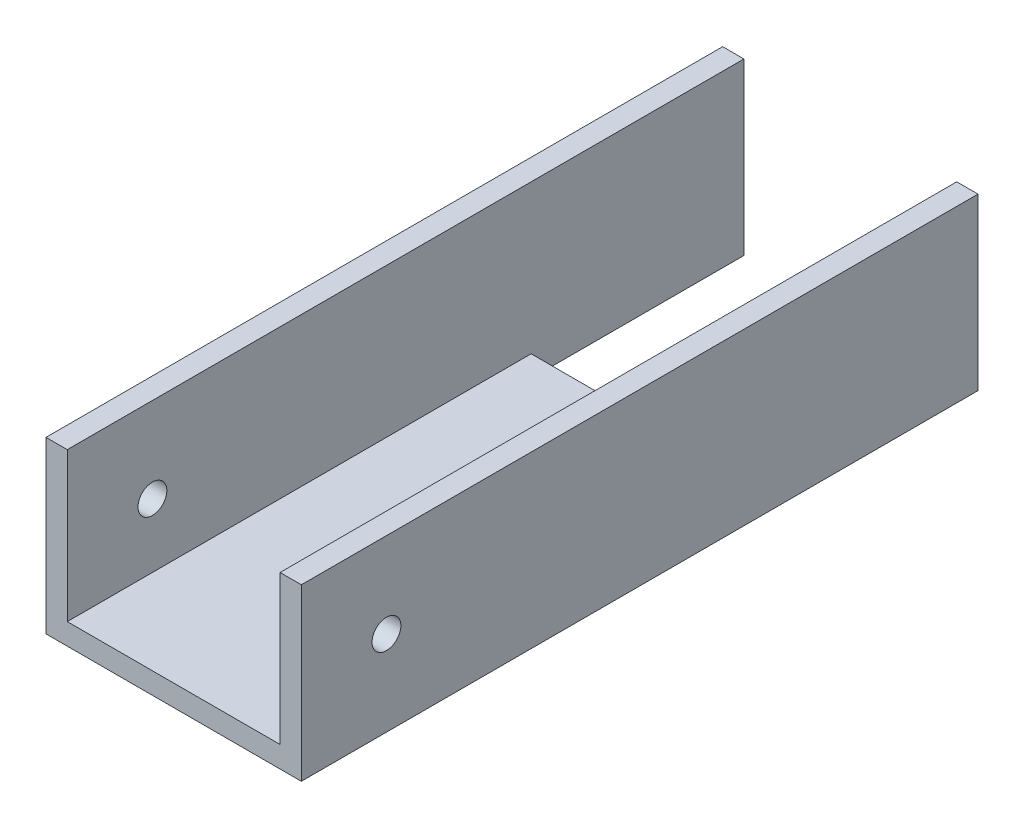
ISO-10303-21;
HEADER;
FILE_DESCRIPTION(('STEP AP214'),'2;1');
FILE_NAME('part.step','',(''),(''),'','','');
FILE_SCHEMA(('AUTOMOTIVE_DESIGN { 1 0 10303 214 1 1 1 1 }'));
ENDSEC;
DATA;
#1=APPLICATION_CONTEXT('core data for automotive mechanical design processes');
#2=APPLICATION_PROTOCOL_DEFINITION('international standard','automotive_design',2000,#1);
#3=PRODUCT_CONTEXT('',#1,'mechanical');
#4=PRODUCT('Part','Part','',(#3));
#5=PRODUCT_RELATED_PRODUCT_CATEGORY('part','',(#4));
#6=PRODUCT_DEFINITION_FORMATION('','',#4);
#7=PRODUCT_DEFINITION_CONTEXT('part definition',#1,'design');
#8=PRODUCT_DEFINITION('design','',#6,#7);
#9=PRODUCT_DEFINITION_SHAPE('','',#8);
#10=(LENGTH_UNIT() NAMED_UNIT(*) SI_UNIT(.MILLI.,.METRE.));
#11=(NAMED_UNIT(*) PLANE_ANGLE_UNIT() SI_UNIT($,.RADIAN.));
#12=(NAMED_UNIT(*) SI_UNIT($,.STERADIAN.) SOLID_ANGLE_UNIT());
#13=UNCERTAINTY_MEASURE_WITH_UNIT(LENGTH_MEASURE(1.E-05),#10,'distance_accuracy_value','');
#14=(GEOMETRIC_REPRESENTATION_CONTEXT(3) GLOBAL_UNCERTAINTY_ASSIGNED_CONTEXT((#13)) GLOBAL_UNIT_ASSIGNED_CONTEXT((#10,
#11,#12)) REPRESENTATION_CONTEXT('',''));
#15=CARTESIAN_POINT('',(0.,0.,0.));
#16=DIRECTION('',(0.,0.,1.));
#17=DIRECTION('',(1.,0.,0.));
#18=AXIS2_PLACEMENT_3D('',#15,#16,#17);
#19=CARTESIAN_POINT('',(0.,0.,-609.6));
#20=DIRECTION('',(0.,0.,1.));
#21=DIRECTION('',(1.,0.,0.));
#22=AXIS2_PLACEMENT_3D('',#19,#20,#21);
#23=PLANE('',#22);
#24=DIRECTION('',(1.,0.,0.));
#25=VECTOR('',#24,1.);
#26=CARTESIAN_POINT('',(-19.05,-12.7,-609.6));
#27=LINE('',#26,#25);
#28=CARTESIAN_POINT('',(15.875,-12.7,-609.6));
#29=VERTEX_POINT('',#28);
#30=CARTESIAN_POINT('',(19.05,-12.7,-609.6));
#31=VERTEX_POINT('',#30);
#32=EDGE_CURVE('E186',#29,#31,#27,.T.);
#33=ORIENTED_EDGE('',*,*,#32,.F.);
#34=DIRECTION('',(0.,-1.,0.));
#35=VECTOR('',#34,1.);
#36=CARTESIAN_POINT('',(15.875,12.7,-609.6));
#37=LINE('',#36,#35);
#38=CARTESIAN_POINT('',(15.875,12.7,-609.6));
#39=VERTEX_POINT('',#38);
#40=EDGE_CURVE('E203',#39,#29,#37,.T.);
#41=ORIENTED_EDGE('',*,*,#40,.F.);
#42=DIRECTION('',(-1.,0.,0.));
#43=VECTOR('',#42,1.);
#44=CARTESIAN_POINT('',(19.05,12.7,-609.6));
#45=LINE('',#44,#43);
#46=CARTESIAN_POINT('',(19.05,12.7,-609.6));
#47=VERTEX_POINT('',#46);
#48=EDGE_CURVE('E196',#47,#39,#45,.T.);
#49=ORIENTED_EDGE('',*,*,#48,.F.);
#50=DIRECTION('',(0.,1.,0.));
#51=VECTOR('',#50,1.);
#52=CARTESIAN_POINT('',(19.05,-12.7,-609.6));
#53=LINE('',#52,#51);
#54=EDGE_CURVE('E191',#31,#47,#53,.T.);
#55=ORIENTED_EDGE('',*,*,#54,.F.);
#56=EDGE_LOOP('',(#33,#41,#49,#55));
#57=FACE_BOUND('',#56,.T.);
#58=ADVANCED_FACE('F44',(#57),#23,.F.);
#59=CARTESIAN_POINT('',(-15.875,12.7,609.6));
#60=DIRECTION('',(0.,-1.,0.));
#61=DIRECTION('',(0.,0.,-1.));
#62=AXIS2_PLACEMENT_3D('',#59,#60,#61);
#63=PLANE('',#62);
#64=DIRECTION('',(0.,0.,-1.));
#65=VECTOR('',#64,1.);
#66=CARTESIAN_POINT('',(-19.05,12.7,609.6));
#67=LINE('',#66,#65);
#68=CARTESIAN_POINT('',(-19.05,12.7,-508.635));
#69=VERTEX_POINT('',#68);
#70=CARTESIAN_POINT('',(-19.05,12.7,-609.6));
#71=VERTEX_POINT('',#70);
#72=EDGE_CURVE('E11',#69,#71,#67,.T.);
#73=ORIENTED_EDGE('',*,*,#72,.F.);
#74=DIRECTION('',(-1.,0.,0.));
#75=VECTOR('',#74,1.);
#76=CARTESIAN_POINT('',(-19.05,12.7,-508.635));
#77=LINE('',#76,#75);
#78=CARTESIAN_POINT('',(-15.875,12.7,-508.635));
#79=VERTEX_POINT('',#78);
#80=EDGE_CURVE('E211',#79,#69,#77,.T.);
#81=ORIENTED_EDGE('',*,*,#80,.F.);
#82=DIRECTION('',(0.,0.,-1.));
#83=VECTOR('',#82,1.);
#84=CARTESIAN_POINT('',(-15.875,12.7,609.6));
#85=LINE('',#84,#83);
#86=CARTESIAN_POINT('',(-15.875,12.7,-609.6));
#87=VERTEX_POINT('',#86);
#88=EDGE_CURVE('E157',#79,#87,#85,.T.);
#89=ORIENTED_EDGE('',*,*,#88,.T.);
#90=DIRECTION('',(-1.,0.,0.));
#91=VECTOR('',#90,1.);
#92=CARTESIAN_POINT('',(-15.875,12.7,-609.6));
#93=LINE('',#92,#91);
#94=EDGE_CURVE('E187',#87,#71,#93,.T.);
#95=ORIENTED_EDGE('',*,*,#94,.T.);
#96=EDGE_LOOP('',(#73,#81,#89,#95));
#97=FACE_BOUND('',#96,.T.);
#98=ADVANCED_FACE('F46',(#97),#63,.F.);
#99=CARTESIAN_POINT('',(-19.05,12.7,609.6));
#100=DIRECTION('',(1.,0.,0.));
#101=DIRECTION('',(0.,1.,0.));
#102=AXIS2_PLACEMENT_3D('',#99,#100,#101);
#103=PLANE('',#102);
#104=CARTESIAN_POINT('',(-19.05,0.,-521.335));
#105=DIRECTION('',(1.,0.,0.));
#106=DIRECTION('',(0.,0.,-1.));
#107=AXIS2_PLACEMENT_3D('',#104,#105,#106);
#108=CIRCLE('',#107,2.15264999999998);
#109=CARTESIAN_POINT('',(-19.05,0.,-523.48765));
#110=VERTEX_POINT('',#109);
#111=EDGE_CURVE('E249',#110,#110,#108,.T.);
#112=ORIENTED_EDGE('',*,*,#111,.T.);
#113=EDGE_LOOP('',(#112));
#114=FACE_BOUND('',#113,.T.);
#115=DIRECTION('',(0.,0.,-1.));
#116=VECTOR('',#115,1.);
#117=CARTESIAN_POINT('',(-19.05,-12.7,609.6));
#118=LINE('',#117,#116);
#119=CARTESIAN_POINT('',(-19.05,-12.7,-508.635));
#120=VERTEX_POINT('',#119);
#121=CARTESIAN_POINT('',(-19.05,-12.7,-609.6));
#122=VERTEX_POINT('',#121);
#123=EDGE_CURVE('E54',#120,#122,#118,.T.);
#124=ORIENTED_EDGE('',*,*,#123,.F.);
#125=DIRECTION('',(0.,-1.,0.));
#126=VECTOR('',#125,1.);
#127=CARTESIAN_POINT('',(-19.05,-12.7,-508.635));
#128=LINE('',#127,#126);
#129=EDGE_CURVE('E146',#69,#120,#128,.T.);
#130=ORIENTED_EDGE('',*,*,#129,.F.);
#131=ORIENTED_EDGE('',*,*,#72,.T.);
#132=DIRECTION('',(0.,-1.,0.));
#133=VECTOR('',#132,1.);
#134=CARTESIAN_POINT('',(-19.05,12.7,-609.6));
#135=LINE('',#134,#133);
#136=EDGE_CURVE('E181',#71,#122,#135,.T.);
#137=ORIENTED_EDGE('',*,*,#136,.T.);
#138=EDGE_LOOP('',(#124,#130,#131,#137));
#139=FACE_BOUND('',#138,.T.);
#140=ADVANCED_FACE('F182',(#114,#139),#103,.F.);
#141=CARTESIAN_POINT('',(-19.05,-12.7,609.6));
#142=DIRECTION('',(0.,1.,0.));
#143=DIRECTION('',(0.,0.,1.));
#144=AXIS2_PLACEMENT_3D('',#141,#142,#143);
#145=PLANE('',#144);
#146=DIRECTION('',(-1.,0.,0.));
#147=VECTOR('',#146,1.);
#148=CARTESIAN_POINT('',(15.875,-12.7,-577.85));
#149=LINE('',#148,#147);
#150=CARTESIAN_POINT('',(15.875,-12.7,-577.85));
#151=VERTEX_POINT('',#150);
#152=CARTESIAN_POINT('',(-15.875,-12.7,-577.85));
#153=VERTEX_POINT('',#152);
#154=EDGE_CURVE('E240',#151,#153,#149,.T.);
#155=ORIENTED_EDGE('',*,*,#154,.F.);
#156=DIRECTION('',(0.,0.,1.));
#157=VECTOR('',#156,1.);
#158=CARTESIAN_POINT('',(15.875,-12.7,-609.6));
#159=LINE('',#158,#157);
#160=EDGE_CURVE('E131',#29,#151,#159,.T.);
#161=ORIENTED_EDGE('',*,*,#160,.F.);
#162=ORIENTED_EDGE('',*,*,#32,.T.);
#163=DIRECTION('',(0.,0.,-1.));
#164=VECTOR('',#163,1.);
#165=CARTESIAN_POINT('',(19.05,-12.7,609.6));
#166=LINE('',#165,#164);
#167=CARTESIAN_POINT('',(19.05,-12.7,-508.635));
#168=VERTEX_POINT('',#167);
#169=EDGE_CURVE('E163',#168,#31,#166,.T.);
#170=ORIENTED_EDGE('',*,*,#169,.F.);
#171=DIRECTION('',(1.,0.,0.));
#172=VECTOR('',#171,1.);
#173=CARTESIAN_POINT('',(19.05,-12.7,-508.635));
#174=LINE('',#173,#172);
#175=EDGE_CURVE('E177',#120,#168,#174,.T.);
#176=ORIENTED_EDGE('',*,*,#175,.F.);
#177=ORIENTED_EDGE('',*,*,#123,.T.);
#178=CARTESIAN_POINT('',(-15.875,-12.7,-609.6));
#179=VERTEX_POINT('',#178);
#180=EDGE_CURVE('E175',#122,#179,#27,.T.);
#181=ORIENTED_EDGE('',*,*,#180,.T.);
#182=DIRECTION('',(0.,0.,-1.));
#183=VECTOR('',#182,1.);
#184=CARTESIAN_POINT('',(-15.875,-12.7,-609.6));
#185=LINE('',#184,#183);
#186=EDGE_CURVE('E137',#153,#179,#185,.T.);
#187=ORIENTED_EDGE('',*,*,#186,.F.);
#188=EDGE_LOOP('',(#155,#161,#162,#170,#176,#177,#181,#187));
#189=FACE_BOUND('',#188,.T.);
#190=ADVANCED_FACE('F173',(#189),#145,.F.);
#191=CARTESIAN_POINT('',(19.05,-12.7,609.6));
#192=DIRECTION('',(-1.,0.,0.));
#193=DIRECTION('',(0.,-1.,0.));
#194=AXIS2_PLACEMENT_3D('',#191,#192,#193);
#195=PLANE('',#194);
#196=CARTESIAN_POINT('',(19.05,0.,-521.335));
#197=DIRECTION('',(1.,0.,0.));
#198=DIRECTION('',(0.,0.,-1.));
#199=AXIS2_PLACEMENT_3D('',#196,#197,#198);
#200=CIRCLE('',#199,2.15264999999999);
#201=CARTESIAN_POINT('',(19.05,0.,-523.48765));
#202=VERTEX_POINT('',#201);
#203=EDGE_CURVE('E253',#202,#202,#200,.T.);
#204=ORIENTED_EDGE('',*,*,#203,.F.);
#205=EDGE_LOOP('',(#204));
#206=FACE_BOUND('',#205,.T.);
#207=DIRECTION('',(0.,0.,-1.));
#208=VECTOR('',#207,1.);
#209=CARTESIAN_POINT('',(19.05,12.7,609.6));
#210=LINE('',#209,#208);
#211=CARTESIAN_POINT('',(19.05,12.7,-508.635));
#212=VERTEX_POINT('',#211);
#213=EDGE_CURVE('E155',#212,#47,#210,.T.);
#214=ORIENTED_EDGE('',*,*,#213,.F.);
#215=DIRECTION('',(0.,1.,0.));
#216=VECTOR('',#215,1.);
#217=CARTESIAN_POINT('',(19.05,12.7,-508.635));
#218=LINE('',#217,#216);
#219=EDGE_CURVE('E229',#168,#212,#218,.T.);
#220=ORIENTED_EDGE('',*,*,#219,.F.);
#221=ORIENTED_EDGE('',*,*,#169,.T.);
#222=ORIENTED_EDGE('',*,*,#54,.T.);
#223=EDGE_LOOP('',(#214,#220,#221,#222));
#224=FACE_BOUND('',#223,.T.);
#225=ADVANCED_FACE('F261',(#206,#224),#195,.F.);
#226=CARTESIAN_POINT('',(19.05,12.7,609.6));
#227=DIRECTION('',(0.,-1.,0.));
#228=DIRECTION('',(0.,0.,-1.));
#229=AXIS2_PLACEMENT_3D('',#226,#227,#228);
#230=PLANE('',#229);
#231=DIRECTION('',(0.,0.,-1.));
#232=VECTOR('',#231,1.);
#233=CARTESIAN_POINT('',(15.875,12.7,609.6));
#234=LINE('',#233,#232);
#235=CARTESIAN_POINT('',(15.875,12.7,-508.635));
#236=VERTEX_POINT('',#235);
#237=EDGE_CURVE('E150',#236,#39,#234,.T.);
#238=ORIENTED_EDGE('',*,*,#237,.F.);
#239=DIRECTION('',(-1.,0.,0.));
#240=VECTOR('',#239,1.);
#241=CARTESIAN_POINT('',(15.875,12.7,-508.635));
#242=LINE('',#241,#240);
#243=EDGE_CURVE('E226',#212,#236,#242,.T.);
#244=ORIENTED_EDGE('',*,*,#243,.F.);
#245=ORIENTED_EDGE('',*,*,#213,.T.);
#246=ORIENTED_EDGE('',*,*,#48,.T.);
#247=EDGE_LOOP('',(#238,#244,#245,#246));
#248=FACE_BOUND('',#247,.T.);
#249=ADVANCED_FACE('F264',(#248),#230,.F.);
#250=CARTESIAN_POINT('',(15.875,12.7,609.6));
#251=DIRECTION('',(1.,0.,0.));
#252=DIRECTION('',(0.,1.,0.));
#253=AXIS2_PLACEMENT_3D('',#250,#251,#252);
#254=PLANE('',#253);
#255=CARTESIAN_POINT('',(15.875,0.,-521.335));
#256=DIRECTION('',(1.,0.,0.));
#257=DIRECTION('',(0.,1.,0.));
#258=AXIS2_PLACEMENT_3D('',#255,#256,#257);
#259=CIRCLE('',#258,2.15264999999998);
#260=CARTESIAN_POINT('',(15.875,2.15264999999999,-521.335));
#261=VERTEX_POINT('',#260);
#262=EDGE_CURVE('E245',#261,#261,#259,.T.);
#263=ORIENTED_EDGE('',*,*,#262,.T.);
#264=EDGE_LOOP('',(#263));
#265=FACE_BOUND('',#264,.T.);
#266=DIRECTION('',(0.,0.,-1.));
#267=VECTOR('',#266,1.);
#268=CARTESIAN_POINT('',(15.875,-9.525,609.6));
#269=LINE('',#268,#267);
#270=CARTESIAN_POINT('',(15.875,-9.525,-508.635));
#271=VERTEX_POINT('',#270);
#272=CARTESIAN_POINT('',(15.875,-9.525,-577.85));
#273=VERTEX_POINT('',#272);
#274=EDGE_CURVE('E129',#271,#273,#269,.T.);
#275=ORIENTED_EDGE('',*,*,#274,.F.);
#276=DIRECTION('',(0.,-1.,0.));
#277=VECTOR('',#276,1.);
#278=CARTESIAN_POINT('',(15.875,-9.525,-508.635));
#279=LINE('',#278,#277);
#280=EDGE_CURVE('E223',#236,#271,#279,.T.);
#281=ORIENTED_EDGE('',*,*,#280,.F.);
#282=ORIENTED_EDGE('',*,*,#237,.T.);
#283=ORIENTED_EDGE('',*,*,#40,.T.);
#284=ORIENTED_EDGE('',*,*,#160,.T.);
#285=DIRECTION('',(0.,-1.,0.));
#286=VECTOR('',#285,1.);
#287=CARTESIAN_POINT('',(15.875,12.701,-577.85));
#288=LINE('',#287,#286);
#289=EDGE_CURVE('E124',#273,#151,#288,.T.);
#290=ORIENTED_EDGE('',*,*,#289,.F.);
#291=EDGE_LOOP('',(#275,#281,#282,#283,#284,#290));
#292=FACE_BOUND('',#291,.T.);
#293=ADVANCED_FACE('F126',(#265,#292),#254,.F.);
#294=CARTESIAN_POINT('',(15.875,-9.525,609.6));
#295=DIRECTION('',(0.,-1.,0.));
#296=DIRECTION('',(1.,0.,0.));
#297=AXIS2_PLACEMENT_3D('',#294,#295,#296);
#298=PLANE('',#297);
#299=ORIENTED_EDGE('',*,*,#274,.T.);
#300=DIRECTION('',(1.,0.,0.));
#301=VECTOR('',#300,1.);
#302=CARTESIAN_POINT('',(15.875,-9.525,-577.85));
#303=LINE('',#302,#301);
#304=CARTESIAN_POINT('',(-15.875,-9.52500000000001,-577.85));
#305=VERTEX_POINT('',#304);
#306=EDGE_CURVE('E140',#305,#273,#303,.T.);
#307=ORIENTED_EDGE('',*,*,#306,.F.);
#308=DIRECTION('',(0.,0.,-1.));
#309=VECTOR('',#308,1.);
#310=CARTESIAN_POINT('',(-15.875,-9.52500000000001,609.6));
#311=LINE('',#310,#309);
#312=CARTESIAN_POINT('',(-15.875,-9.52500000000001,-508.634999999999));
#313=VERTEX_POINT('',#312);
#314=EDGE_CURVE('E151',#313,#305,#311,.T.);
#315=ORIENTED_EDGE('',*,*,#314,.F.);
#316=DIRECTION('',(-1.,0.,0.));
#317=VECTOR('',#316,1.);
#318=CARTESIAN_POINT('',(-15.875,-9.52500000000001,-508.635));
#319=LINE('',#318,#317);
#320=EDGE_CURVE('E69',#271,#313,#319,.T.);
#321=ORIENTED_EDGE('',*,*,#320,.F.);
#322=EDGE_LOOP('',(#299,#307,#315,#321));
#323=FACE_BOUND('',#322,.T.);
#324=ADVANCED_FACE('F148',(#323),#298,.F.);
#325=CARTESIAN_POINT('',(-15.875,-9.52500000000001,609.6));
#326=DIRECTION('',(-1.,0.,0.));
#327=DIRECTION('',(0.,0.,1.));
#328=AXIS2_PLACEMENT_3D('',#325,#326,#327);
#329=PLANE('',#328);
#330=CARTESIAN_POINT('',(-15.875,0.,-521.335));
#331=DIRECTION('',(-1.,0.,0.));
#332=DIRECTION('',(0.,0.,1.));
#333=AXIS2_PLACEMENT_3D('',#330,#331,#332);
#334=CIRCLE('',#333,2.15264999999998);
#335=CARTESIAN_POINT('',(-15.875,0.,-519.18235));
#336=VERTEX_POINT('',#335);
#337=EDGE_CURVE('E48',#336,#336,#334,.T.);
#338=ORIENTED_EDGE('',*,*,#337,.T.);
#339=EDGE_LOOP('',(#338));
#340=FACE_BOUND('',#339,.T.);
#341=ORIENTED_EDGE('',*,*,#88,.F.);
#342=DIRECTION('',(0.,1.,0.));
#343=VECTOR('',#342,1.);
#344=CARTESIAN_POINT('',(-15.875,12.7,-508.635));
#345=LINE('',#344,#343);
#346=EDGE_CURVE('E216',#313,#79,#345,.T.);
#347=ORIENTED_EDGE('',*,*,#346,.F.);
#348=ORIENTED_EDGE('',*,*,#314,.T.);
#349=DIRECTION('',(0.,-1.,0.));
#350=VECTOR('',#349,1.);
#351=CARTESIAN_POINT('',(-15.875,12.701,-577.85));
#352=LINE('',#351,#350);
#353=EDGE_CURVE('E136',#305,#153,#352,.T.);
#354=ORIENTED_EDGE('',*,*,#353,.T.);
#355=ORIENTED_EDGE('',*,*,#186,.T.);
#356=DIRECTION('',(0.,1.,0.));
#357=VECTOR('',#356,1.);
#358=CARTESIAN_POINT('',(-15.875,-9.52500000000001,-609.6));
#359=LINE('',#358,#357);
#360=EDGE_CURVE('E61',#179,#87,#359,.T.);
#361=ORIENTED_EDGE('',*,*,#360,.T.);
#362=EDGE_LOOP('',(#341,#347,#348,#354,#355,#361));
#363=FACE_BOUND('',#362,.T.);
#364=ADVANCED_FACE('F213',(#340,#363),#329,.F.);
#365=ORIENTED_EDGE('',*,*,#360,.F.);
#366=ORIENTED_EDGE('',*,*,#180,.F.);
#367=ORIENTED_EDGE('',*,*,#136,.F.);
#368=ORIENTED_EDGE('',*,*,#94,.F.);
#369=EDGE_LOOP('',(#365,#366,#367,#368));
#370=FACE_BOUND('',#369,.T.);
#371=ADVANCED_FACE('F189',(#370),#23,.F.);
#372=CARTESIAN_POINT('',(0.,0.,-508.635));
#373=DIRECTION('',(0.,0.,-1.));
#374=DIRECTION('',(-1.,0.,0.));
#375=AXIS2_PLACEMENT_3D('',#372,#373,#374);
#376=PLANE('',#375);
#377=ORIENTED_EDGE('',*,*,#129,.T.);
#378=ORIENTED_EDGE('',*,*,#175,.T.);
#379=ORIENTED_EDGE('',*,*,#219,.T.);
#380=ORIENTED_EDGE('',*,*,#243,.T.);
#381=ORIENTED_EDGE('',*,*,#280,.T.);
#382=ORIENTED_EDGE('',*,*,#320,.T.);
#383=ORIENTED_EDGE('',*,*,#346,.T.);
#384=ORIENTED_EDGE('',*,*,#80,.T.);
#385=EDGE_LOOP('',(#377,#378,#379,#380,#381,#382,#383,#384));
#386=FACE_BOUND('',#385,.T.);
#387=ADVANCED_FACE('F274',(#386),#376,.F.);
#388=CARTESIAN_POINT('',(15.875,12.701,-577.85));
#389=DIRECTION('',(0.,0.,1.));
#390=DIRECTION('',(1.,0.,0.));
#391=AXIS2_PLACEMENT_3D('',#388,#389,#390);
#392=PLANE('',#391);
#393=ORIENTED_EDGE('',*,*,#306,.T.);
#394=ORIENTED_EDGE('',*,*,#289,.T.);
#395=ORIENTED_EDGE('',*,*,#154,.T.);
#396=ORIENTED_EDGE('',*,*,#353,.F.);
#397=EDGE_LOOP('',(#393,#394,#395,#396));
#398=FACE_BOUND('',#397,.T.);
#399=ADVANCED_FACE('F141',(#398),#392,.F.);
#400=CARTESIAN_POINT('',(19.05,0.,-521.335));
#401=DIRECTION('',(1.,0.,0.));
#402=DIRECTION('',(0.,0.,-1.));
#403=AXIS2_PLACEMENT_3D('',#400,#401,#402);
#404=CYLINDRICAL_SURFACE('',#403,2.15264999999998);
#405=ORIENTED_EDGE('',*,*,#111,.F.);
#406=EDGE_LOOP('',(#405));
#407=FACE_BOUND('',#406,.T.);
#408=ORIENTED_EDGE('',*,*,#337,.F.);
#409=EDGE_LOOP('',(#408));
#410=FACE_BOUND('',#409,.T.);
#411=ADVANCED_FACE('F311',(#407,#410),#404,.F.);
#412=ORIENTED_EDGE('',*,*,#203,.T.);
#413=EDGE_LOOP('',(#412));
#414=FACE_BOUND('',#413,.T.);
#415=ORIENTED_EDGE('',*,*,#262,.F.);
#416=EDGE_LOOP('',(#415));
#417=FACE_BOUND('',#416,.T.);
#418=ADVANCED_FACE('F258',(#414,#417),#404,.F.);
#419=CLOSED_SHELL('',(#58,#98,#140,#190,#225,#249,#293,#324,#364,#371,#387,#399,#411,#418));
#420=MANIFOLD_SOLID_BREP('B2',#419);
#421=ADVANCED_BREP_SHAPE_REPRESENTATION('',(#18,#420),#14);
#422=SHAPE_DEFINITION_REPRESENTATION(#9,#421);
ENDSEC;
END-ISO-10303-21;
